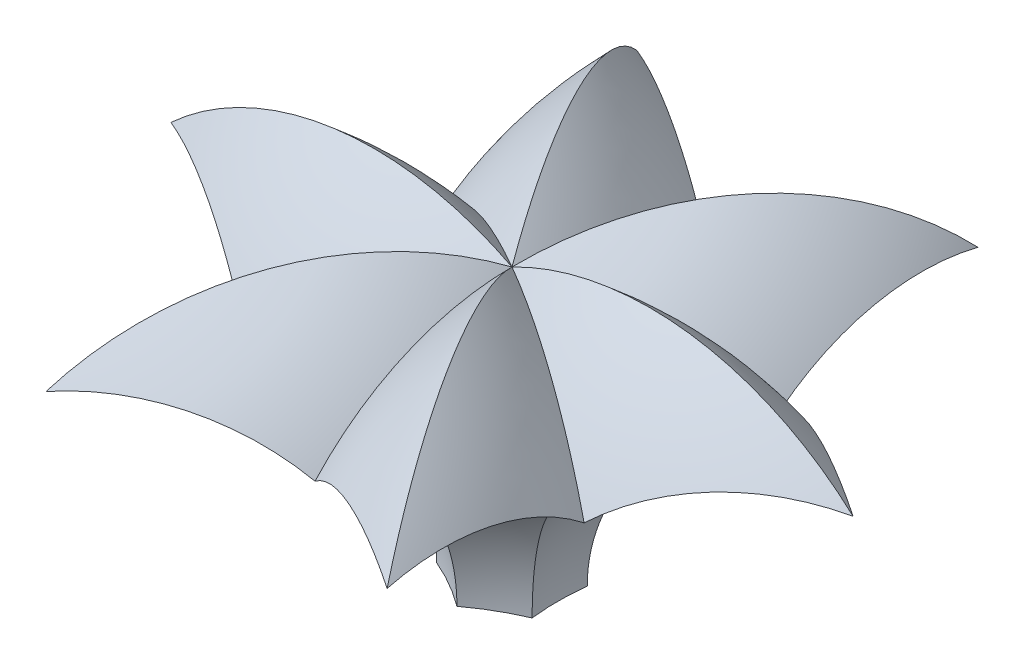
ISO-10303-21;
HEADER;
FILE_DESCRIPTION(('STEP AP214'),'2;1');
FILE_NAME('part.step','',(''),(''),'','','');
FILE_SCHEMA(('AUTOMOTIVE_DESIGN { 1 0 10303 214 1 1 1 1 }'));
ENDSEC;
DATA;
#1=APPLICATION_CONTEXT('core data for automotive mechanical design processes');
#2=APPLICATION_PROTOCOL_DEFINITION('international standard','automotive_design',2000,#1);
#3=PRODUCT_CONTEXT('',#1,'mechanical');
#4=PRODUCT('Part','Part','',(#3));
#5=PRODUCT_RELATED_PRODUCT_CATEGORY('part','',(#4));
#6=PRODUCT_DEFINITION_FORMATION('','',#4);
#7=PRODUCT_DEFINITION_CONTEXT('part definition',#1,'design');
#8=PRODUCT_DEFINITION('design','',#6,#7);
#9=PRODUCT_DEFINITION_SHAPE('','',#8);
#10=(LENGTH_UNIT() NAMED_UNIT(*) SI_UNIT(.MILLI.,.METRE.));
#11=(NAMED_UNIT(*) PLANE_ANGLE_UNIT() SI_UNIT($,.RADIAN.));
#12=(NAMED_UNIT(*) SI_UNIT($,.STERADIAN.) SOLID_ANGLE_UNIT());
#13=UNCERTAINTY_MEASURE_WITH_UNIT(LENGTH_MEASURE(1.E-05),#10,'distance_accuracy_value','');
#14=(GEOMETRIC_REPRESENTATION_CONTEXT(3) GLOBAL_UNCERTAINTY_ASSIGNED_CONTEXT((#13)) GLOBAL_UNIT_ASSIGNED_CONTEXT((#10,
#11,#12)) REPRESENTATION_CONTEXT('',''));
#15=CARTESIAN_POINT('',(0.,0.,0.));
#16=DIRECTION('',(0.,0.,1.));
#17=DIRECTION('',(1.,0.,0.));
#18=AXIS2_PLACEMENT_3D('',#15,#16,#17);
#19=CARTESIAN_POINT('',(-22.5000000000005,0.,-38.9711431702995));
#20=DIRECTION('',(0.,0.,1.));
#21=DIRECTION('',(-1.,0.,0.));
#22=AXIS2_PLACEMENT_3D('',#19,#20,#21);
#23=SPHERICAL_SURFACE('',#22,37.5);
#24=CARTESIAN_POINT('',(-19.8611111111113,0.,-43.5418328013845));
#25=DIRECTION('',(0.499999999999995,0.,-0.866025403784441));
#26=DIRECTION('',(-0.866025403784442,0.,-0.499999999999995));
#27=AXIS2_PLACEMENT_3D('',#24,#25,#26);
#28=CIRCLE('',#27,37.1267432146746);
#29=CARTESIAN_POINT('',(-27.7777777777772,35.9837497617132,-48.1125224324685));
#30=VERTEX_POINT('',#29);
#31=CARTESIAN_POINT('',(0.,29.1966336353671,-32.0750149549794));
#32=VERTEX_POINT('',#31);
#33=EDGE_CURVE('E189',#30,#32,#28,.T.);
#34=ORIENTED_EDGE('',*,*,#33,.T.);
#35=CARTESIAN_POINT('',(0.,0.,-38.9711431702995));
#36=DIRECTION('',(-1.,0.,0.));
#37=DIRECTION('',(0.,0.,1.));
#38=AXIS2_PLACEMENT_3D('',#35,#36,#37);
#39=CIRCLE('',#38,29.9999999999997);
#40=CARTESIAN_POINT('',(0.,0.,-8.97114317029982));
#41=VERTEX_POINT('',#40);
#42=EDGE_CURVE('E199',#41,#32,#39,.T.);
#43=ORIENTED_EDGE('',*,*,#42,.F.);
#44=CARTESIAN_POINT('',(-22.5000000000005,0.,-38.9711431702995));
#45=DIRECTION('',(0.,1.,0.));
#46=DIRECTION('',(0.,0.,1.));
#47=AXIS2_PLACEMENT_3D('',#44,#45,#46);
#48=CIRCLE('',#47,37.5);
#49=CARTESIAN_POINT('',(-7.76923788646684,0.,-4.4855715851498));
#50=VERTEX_POINT('',#49);
#51=EDGE_CURVE('E175',#50,#41,#48,.T.);
#52=ORIENTED_EDGE('',*,*,#51,.F.);
#53=CARTESIAN_POINT('',(-33.7500000000002,0.,-19.4855715851497));
#54=DIRECTION('',(-0.499999999999995,0.,0.866025403784441));
#55=DIRECTION('',(0.866025403784442,0.,0.499999999999995));
#56=AXIS2_PLACEMENT_3D('',#53,#54,#55);
#57=CIRCLE('',#56,30.0000000000002);
#58=CARTESIAN_POINT('',(-27.7777777777778,29.1966336353671,-16.03750747749));
#59=VERTEX_POINT('',#58);
#60=EDGE_CURVE('E202',#50,#59,#57,.T.);
#61=ORIENTED_EDGE('',*,*,#60,.T.);
#62=CARTESIAN_POINT('',(-27.7777777777772,0.,-38.9711431702995));
#63=DIRECTION('',(-1.,0.,0.));
#64=DIRECTION('',(0.,0.,1.));
#65=AXIS2_PLACEMENT_3D('',#62,#63,#64);
#66=CIRCLE('',#65,37.1267432146749);
#67=EDGE_CURVE('E191',#59,#30,#66,.T.);
#68=ORIENTED_EDGE('',*,*,#67,.T.);
#69=EDGE_LOOP('',(#34,#43,#52,#61,#68));
#70=FACE_BOUND('',#69,.T.);
#71=ADVANCED_FACE('F33',(#70),#23,.F.);
#72=CARTESIAN_POINT('',(-22.5000000000005,0.,38.9711431702995));
#73=DIRECTION('',(0.,0.,1.));
#74=DIRECTION('',(-1.,0.,0.));
#75=AXIS2_PLACEMENT_3D('',#72,#73,#74);
#76=SPHERICAL_SURFACE('',#75,37.5);
#77=CARTESIAN_POINT('',(-19.8611111111113,0.,43.5418328013845));
#78=DIRECTION('',(0.499999999999995,0.,0.866025403784441));
#79=DIRECTION('',(0.866025403784442,0.,-0.499999999999995));
#80=AXIS2_PLACEMENT_3D('',#77,#78,#79);
#81=CIRCLE('',#80,37.1267432146746);
#82=CARTESIAN_POINT('',(0.,29.1966336353671,32.0750149549794));
#83=VERTEX_POINT('',#82);
#84=CARTESIAN_POINT('',(-27.7777777777772,35.9837497617132,48.1125224324685));
#85=VERTEX_POINT('',#84);
#86=EDGE_CURVE('E195',#83,#85,#81,.T.);
#87=ORIENTED_EDGE('',*,*,#86,.T.);
#88=CARTESIAN_POINT('',(-27.7777777777772,0.,38.9711431702995));
#89=DIRECTION('',(-1.,0.,0.));
#90=DIRECTION('',(0.,0.,1.));
#91=AXIS2_PLACEMENT_3D('',#88,#89,#90);
#92=CIRCLE('',#91,37.1267432146749);
#93=CARTESIAN_POINT('',(-27.7777777777778,29.1966336353671,16.03750747749));
#94=VERTEX_POINT('',#93);
#95=EDGE_CURVE('E58',#85,#94,#92,.T.);
#96=ORIENTED_EDGE('',*,*,#95,.T.);
#97=CARTESIAN_POINT('',(-33.7500000000002,0.,19.4855715851497));
#98=DIRECTION('',(0.499999999999995,0.,0.866025403784441));
#99=DIRECTION('',(0.866025403784442,0.,-0.499999999999995));
#100=AXIS2_PLACEMENT_3D('',#97,#98,#99);
#101=CIRCLE('',#100,30.0000000000002);
#102=CARTESIAN_POINT('',(-7.76923788646684,0.,4.4855715851498));
#103=VERTEX_POINT('',#102);
#104=EDGE_CURVE('E204',#103,#94,#101,.T.);
#105=ORIENTED_EDGE('',*,*,#104,.F.);
#106=CARTESIAN_POINT('',(-22.5000000000005,0.,38.9711431702995));
#107=DIRECTION('',(0.,1.,0.));
#108=DIRECTION('',(0.,0.,1.));
#109=AXIS2_PLACEMENT_3D('',#106,#107,#108);
#110=CIRCLE('',#109,37.5);
#111=CARTESIAN_POINT('',(0.,0.,8.97114317029982));
#112=VERTEX_POINT('',#111);
#113=EDGE_CURVE('E177',#112,#103,#110,.T.);
#114=ORIENTED_EDGE('',*,*,#113,.F.);
#115=CARTESIAN_POINT('',(0.,0.,38.9711431702995));
#116=DIRECTION('',(1.,0.,0.));
#117=DIRECTION('',(0.,0.,-1.));
#118=AXIS2_PLACEMENT_3D('',#115,#116,#117);
#119=CIRCLE('',#118,29.9999999999997);
#120=EDGE_CURVE('E37',#112,#83,#119,.T.);
#121=ORIENTED_EDGE('',*,*,#120,.T.);
#122=EDGE_LOOP('',(#87,#96,#105,#114,#121));
#123=FACE_BOUND('',#122,.T.);
#124=ADVANCED_FACE('F211',(#123),#76,.F.);
#125=CARTESIAN_POINT('',(22.5000000000005,0.,38.9711431702995));
#126=DIRECTION('',(0.,0.,1.));
#127=DIRECTION('',(-1.,0.,0.));
#128=AXIS2_PLACEMENT_3D('',#125,#126,#127);
#129=SPHERICAL_SURFACE('',#128,37.5);
#130=CARTESIAN_POINT('',(19.8611111111113,0.,43.5418328013845));
#131=DIRECTION('',(-0.499999999999995,0.,0.866025403784442));
#132=DIRECTION('',(0.866025403784442,0.,0.499999999999995));
#133=AXIS2_PLACEMENT_3D('',#130,#131,#132);
#134=CIRCLE('',#133,37.1267432146746);
#135=CARTESIAN_POINT('',(27.7777777777772,35.9837497617132,48.1125224324685));
#136=VERTEX_POINT('',#135);
#137=EDGE_CURVE('E193',#136,#83,#134,.T.);
#138=ORIENTED_EDGE('',*,*,#137,.T.);
#139=ORIENTED_EDGE('',*,*,#120,.F.);
#140=CARTESIAN_POINT('',(22.5000000000005,0.,38.9711431702995));
#141=DIRECTION('',(0.,1.,0.));
#142=DIRECTION('',(0.,0.,1.));
#143=AXIS2_PLACEMENT_3D('',#140,#141,#142);
#144=CIRCLE('',#143,37.5);
#145=CARTESIAN_POINT('',(7.76923788646684,0.,4.4855715851498));
#146=VERTEX_POINT('',#145);
#147=EDGE_CURVE('E127',#146,#112,#144,.T.);
#148=ORIENTED_EDGE('',*,*,#147,.F.);
#149=CARTESIAN_POINT('',(33.7500000000002,0.,19.4855715851497));
#150=DIRECTION('',(-0.499999999999995,0.,0.866025403784442));
#151=DIRECTION('',(0.866025403784442,0.,0.499999999999995));
#152=AXIS2_PLACEMENT_3D('',#149,#150,#151);
#153=CIRCLE('',#152,30.0000000000002);
#154=CARTESIAN_POINT('',(27.7777777777778,29.1966336353671,16.03750747749));
#155=VERTEX_POINT('',#154);
#156=EDGE_CURVE('E122',#155,#146,#153,.T.);
#157=ORIENTED_EDGE('',*,*,#156,.F.);
#158=CARTESIAN_POINT('',(27.7777777777772,0.,38.9711431702995));
#159=DIRECTION('',(1.,0.,0.));
#160=DIRECTION('',(0.,0.,-1.));
#161=AXIS2_PLACEMENT_3D('',#158,#159,#160);
#162=CIRCLE('',#161,37.1267432146749);
#163=EDGE_CURVE('E111',#136,#155,#162,.F.);
#164=ORIENTED_EDGE('',*,*,#163,.F.);
#165=EDGE_LOOP('',(#138,#139,#148,#157,#164));
#166=FACE_BOUND('',#165,.T.);
#167=ADVANCED_FACE('F124',(#166),#129,.F.);
#168=CARTESIAN_POINT('',(-45.,0.,0.));
#169=DIRECTION('',(0.,0.,1.));
#170=DIRECTION('',(-1.,0.,0.));
#171=AXIS2_PLACEMENT_3D('',#168,#169,#170);
#172=SPHERICAL_SURFACE('',#171,37.5);
#173=ORIENTED_EDGE('',*,*,#60,.F.);
#174=CARTESIAN_POINT('',(-45.,0.,0.));
#175=DIRECTION('',(0.,1.,0.));
#176=DIRECTION('',(0.,0.,1.));
#177=AXIS2_PLACEMENT_3D('',#174,#175,#176);
#178=CIRCLE('',#177,37.5);
#179=EDGE_CURVE('E160',#103,#50,#178,.T.);
#180=ORIENTED_EDGE('',*,*,#179,.F.);
#181=ORIENTED_EDGE('',*,*,#104,.T.);
#182=CARTESIAN_POINT('',(-47.6388888888891,0.,4.57068963108498));
#183=DIRECTION('',(-0.499999999999995,0.,0.866025403784441));
#184=DIRECTION('',(0.866025403784442,0.,0.499999999999995));
#185=AXIS2_PLACEMENT_3D('',#182,#183,#184);
#186=CIRCLE('',#185,37.1267432146746);
#187=CARTESIAN_POINT('',(-55.5555555555566,35.9837497617127,0.));
#188=VERTEX_POINT('',#187);
#189=EDGE_CURVE('E137',#94,#188,#186,.T.);
#190=ORIENTED_EDGE('',*,*,#189,.T.);
#191=CARTESIAN_POINT('',(-47.6388888888891,0.,-4.57068963108498));
#192=DIRECTION('',(-0.499999999999995,0.,-0.866025403784441));
#193=DIRECTION('',(-0.866025403784442,0.,0.499999999999995));
#194=AXIS2_PLACEMENT_3D('',#191,#192,#193);
#195=CIRCLE('',#194,37.1267432146746);
#196=EDGE_CURVE('E119',#59,#188,#195,.F.);
#197=ORIENTED_EDGE('',*,*,#196,.F.);
#198=EDGE_LOOP('',(#173,#180,#181,#190,#197));
#199=FACE_BOUND('',#198,.T.);
#200=ADVANCED_FACE('F225',(#199),#172,.F.);
#201=CARTESIAN_POINT('',(45.,0.,0.));
#202=DIRECTION('',(0.,0.,1.));
#203=DIRECTION('',(-1.,0.,0.));
#204=AXIS2_PLACEMENT_3D('',#201,#202,#203);
#205=SPHERICAL_SURFACE('',#204,37.5);
#206=CARTESIAN_POINT('',(47.6388888888891,0.,-4.570689631085));
#207=DIRECTION('',(0.499999999999995,0.,-0.866025403784442));
#208=DIRECTION('',(-0.866025403784442,0.,-0.499999999999995));
#209=AXIS2_PLACEMENT_3D('',#206,#207,#208);
#210=CIRCLE('',#209,37.1267432146746);
#211=CARTESIAN_POINT('',(27.7777777777778,29.1966336353671,-16.03750747749));
#212=VERTEX_POINT('',#211);
#213=CARTESIAN_POINT('',(55.5555555555567,35.9837497617127,0.));
#214=VERTEX_POINT('',#213);
#215=EDGE_CURVE('E136',#212,#214,#210,.T.);
#216=ORIENTED_EDGE('',*,*,#215,.T.);
#217=CARTESIAN_POINT('',(47.6388888888891,0.,4.570689631085));
#218=DIRECTION('',(0.499999999999995,0.,0.866025403784442));
#219=DIRECTION('',(0.866025403784442,0.,-0.499999999999995));
#220=AXIS2_PLACEMENT_3D('',#217,#218,#219);
#221=CIRCLE('',#220,37.1267432146746);
#222=EDGE_CURVE('E133',#214,#155,#221,.T.);
#223=ORIENTED_EDGE('',*,*,#222,.T.);
#224=ORIENTED_EDGE('',*,*,#156,.T.);
#225=CARTESIAN_POINT('',(45.,0.,0.));
#226=DIRECTION('',(0.,1.,0.));
#227=DIRECTION('',(0.,0.,1.));
#228=AXIS2_PLACEMENT_3D('',#225,#226,#227);
#229=CIRCLE('',#228,37.5);
#230=CARTESIAN_POINT('',(7.76923788646684,0.,-4.4855715851498));
#231=VERTEX_POINT('',#230);
#232=EDGE_CURVE('E155',#231,#146,#229,.T.);
#233=ORIENTED_EDGE('',*,*,#232,.F.);
#234=CARTESIAN_POINT('',(33.7500000000002,0.,-19.4855715851497));
#235=DIRECTION('',(-0.499999999999995,0.,-0.866025403784442));
#236=DIRECTION('',(-0.866025403784442,0.,0.499999999999995));
#237=AXIS2_PLACEMENT_3D('',#234,#235,#236);
#238=CIRCLE('',#237,30.0000000000002);
#239=EDGE_CURVE('E130',#231,#212,#238,.T.);
#240=ORIENTED_EDGE('',*,*,#239,.T.);
#241=EDGE_LOOP('',(#216,#223,#224,#233,#240));
#242=FACE_BOUND('',#241,.T.);
#243=ADVANCED_FACE('F134',(#242),#205,.F.);
#244=CARTESIAN_POINT('',(22.5000000000005,0.,-38.9711431702995));
#245=DIRECTION('',(0.,0.,1.));
#246=DIRECTION('',(-1.,0.,0.));
#247=AXIS2_PLACEMENT_3D('',#244,#245,#246);
#248=SPHERICAL_SURFACE('',#247,37.5);
#249=CARTESIAN_POINT('',(19.8611111111113,0.,-43.5418328013845));
#250=DIRECTION('',(-0.499999999999995,0.,-0.866025403784442));
#251=DIRECTION('',(-0.866025403784442,0.,0.499999999999995));
#252=AXIS2_PLACEMENT_3D('',#249,#250,#251);
#253=CIRCLE('',#252,37.1267432146746);
#254=CARTESIAN_POINT('',(27.7777777777772,35.9837497617132,-48.1125224324685));
#255=VERTEX_POINT('',#254);
#256=EDGE_CURVE('E183',#32,#255,#253,.T.);
#257=ORIENTED_EDGE('',*,*,#256,.T.);
#258=CARTESIAN_POINT('',(27.7777777777772,0.,-38.9711431702995));
#259=DIRECTION('',(1.,0.,0.));
#260=DIRECTION('',(0.,0.,-1.));
#261=AXIS2_PLACEMENT_3D('',#258,#259,#260);
#262=CIRCLE('',#261,37.1267432146749);
#263=EDGE_CURVE('E186',#255,#212,#262,.T.);
#264=ORIENTED_EDGE('',*,*,#263,.T.);
#265=ORIENTED_EDGE('',*,*,#239,.F.);
#266=CARTESIAN_POINT('',(22.5000000000005,0.,-38.9711431702995));
#267=DIRECTION('',(0.,1.,0.));
#268=DIRECTION('',(0.,0.,1.));
#269=AXIS2_PLACEMENT_3D('',#266,#267,#268);
#270=CIRCLE('',#269,37.5);
#271=EDGE_CURVE('E171',#41,#231,#270,.T.);
#272=ORIENTED_EDGE('',*,*,#271,.F.);
#273=ORIENTED_EDGE('',*,*,#42,.T.);
#274=EDGE_LOOP('',(#257,#264,#265,#272,#273));
#275=FACE_BOUND('',#274,.T.);
#276=ADVANCED_FACE('F241',(#275),#248,.F.);
#277=CARTESIAN_POINT('',(22.5000000000005,0.,38.9711431702995));
#278=DIRECTION('',(0.,0.,1.));
#279=DIRECTION('',(-1.,0.,0.));
#280=AXIS2_PLACEMENT_3D('',#277,#278,#279);
#281=SPHERICAL_SURFACE('',#280,62.5);
#282=ORIENTED_EDGE('',*,*,#215,.F.);
#283=CARTESIAN_POINT('',(0.,0.,0.));
#284=DIRECTION('',(0.50000000000001,0.,0.866025403784433));
#285=DIRECTION('',(0.866025403784433,0.,-0.50000000000001));
#286=AXIS2_PLACEMENT_3D('',#283,#284,#285);
#287=CIRCLE('',#286,43.3733789322437);
#288=CARTESIAN_POINT('',(0.,43.3733789322437,0.));
#289=VERTEX_POINT('',#288);
#290=EDGE_CURVE('E140',#212,#289,#287,.T.);
#291=ORIENTED_EDGE('',*,*,#290,.T.);
#292=CARTESIAN_POINT('',(22.5000000000005,0.,0.));
#293=DIRECTION('',(0.,0.,1.));
#294=DIRECTION('',(1.,0.,0.));
#295=AXIS2_PLACEMENT_3D('',#292,#293,#294);
#296=CIRCLE('',#295,48.8620507142304);
#297=EDGE_CURVE('E50',#214,#289,#296,.T.);
#298=ORIENTED_EDGE('',*,*,#297,.F.);
#299=EDGE_LOOP('',(#282,#291,#298));
#300=FACE_BOUND('',#299,.T.);
#301=ADVANCED_FACE('F250',(#300),#281,.T.);
#302=CARTESIAN_POINT('',(45.,0.,0.));
#303=DIRECTION('',(0.,0.,1.));
#304=DIRECTION('',(-1.,0.,0.));
#305=AXIS2_PLACEMENT_3D('',#302,#303,#304);
#306=SPHERICAL_SURFACE('',#305,62.5);
#307=ORIENTED_EDGE('',*,*,#256,.F.);
#308=CARTESIAN_POINT('',(0.,0.,0.));
#309=DIRECTION('',(1.,0.,0.));
#310=DIRECTION('',(0.,0.,-1.));
#311=AXIS2_PLACEMENT_3D('',#308,#309,#310);
#312=CIRCLE('',#311,43.3733789322437);
#313=EDGE_CURVE('E145',#32,#289,#312,.T.);
#314=ORIENTED_EDGE('',*,*,#313,.T.);
#315=CARTESIAN_POINT('',(11.2499999999998,0.,-19.4855715851497));
#316=DIRECTION('',(0.866025403784441,0.,0.499999999999995));
#317=DIRECTION('',(0.499999999999995,0.,-0.866025403784442));
#318=AXIS2_PLACEMENT_3D('',#315,#316,#317);
#319=CIRCLE('',#318,48.8620507142301);
#320=EDGE_CURVE('E148',#255,#289,#319,.T.);
#321=ORIENTED_EDGE('',*,*,#320,.F.);
#322=EDGE_LOOP('',(#307,#314,#321));
#323=FACE_BOUND('',#322,.T.);
#324=ADVANCED_FACE('F245',(#323),#306,.T.);
#325=CARTESIAN_POINT('',(-45.,0.,0.));
#326=DIRECTION('',(0.,0.,1.));
#327=DIRECTION('',(-1.,0.,0.));
#328=AXIS2_PLACEMENT_3D('',#325,#326,#327);
#329=SPHERICAL_SURFACE('',#328,62.5);
#330=ORIENTED_EDGE('',*,*,#33,.F.);
#331=CARTESIAN_POINT('',(-11.2499999999998,0.,-19.4855715851497));
#332=DIRECTION('',(0.866025403784441,0.,-0.499999999999995));
#333=DIRECTION('',(-0.499999999999995,0.,-0.866025403784442));
#334=AXIS2_PLACEMENT_3D('',#331,#332,#333);
#335=CIRCLE('',#334,48.8620507142301);
#336=EDGE_CURVE('E153',#30,#289,#335,.T.);
#337=ORIENTED_EDGE('',*,*,#336,.T.);
#338=ORIENTED_EDGE('',*,*,#313,.F.);
#339=EDGE_LOOP('',(#330,#337,#338));
#340=FACE_BOUND('',#339,.T.);
#341=ADVANCED_FACE('F237',(#340),#329,.T.);
#342=CARTESIAN_POINT('',(-22.5000000000005,0.,38.9711431702995));
#343=DIRECTION('',(0.,0.,-1.));
#344=DIRECTION('',(1.,0.,0.));
#345=AXIS2_PLACEMENT_3D('',#342,#343,#344);
#346=SPHERICAL_SURFACE('',#345,62.5);
#347=CARTESIAN_POINT('',(0.,0.,0.));
#348=DIRECTION('',(-0.50000000000001,0.,0.866025403784433));
#349=DIRECTION('',(0.866025403784433,0.,0.50000000000001));
#350=AXIS2_PLACEMENT_3D('',#347,#348,#349);
#351=CIRCLE('',#350,43.3733789322437);
#352=EDGE_CURVE('E164',#59,#289,#351,.F.);
#353=ORIENTED_EDGE('',*,*,#352,.F.);
#354=ORIENTED_EDGE('',*,*,#196,.T.);
#355=CARTESIAN_POINT('',(-22.5000000000005,0.,0.));
#356=DIRECTION('',(0.,0.,1.));
#357=DIRECTION('',(1.,0.,0.));
#358=AXIS2_PLACEMENT_3D('',#355,#356,#357);
#359=CIRCLE('',#358,48.8620507142304);
#360=EDGE_CURVE('E149',#188,#289,#359,.F.);
#361=ORIENTED_EDGE('',*,*,#360,.T.);
#362=EDGE_LOOP('',(#353,#354,#361));
#363=FACE_BOUND('',#362,.T.);
#364=ADVANCED_FACE('F231',(#363),#346,.T.);
#365=CARTESIAN_POINT('',(22.5000000000005,0.,-38.9711431702995));
#366=DIRECTION('',(0.,0.,1.));
#367=DIRECTION('',(-1.,0.,0.));
#368=AXIS2_PLACEMENT_3D('',#365,#366,#367);
#369=SPHERICAL_SURFACE('',#368,62.5);
#370=ORIENTED_EDGE('',*,*,#67,.F.);
#371=ORIENTED_EDGE('',*,*,#352,.T.);
#372=ORIENTED_EDGE('',*,*,#336,.F.);
#373=EDGE_LOOP('',(#370,#371,#372));
#374=FACE_BOUND('',#373,.T.);
#375=ADVANCED_FACE('F234',(#374),#369,.T.);
#376=CARTESIAN_POINT('',(-22.5000000000005,0.,-38.9711431702995));
#377=DIRECTION('',(0.,0.,1.));
#378=DIRECTION('',(-1.,0.,0.));
#379=AXIS2_PLACEMENT_3D('',#376,#377,#378);
#380=SPHERICAL_SURFACE('',#379,62.5);
#381=ORIENTED_EDGE('',*,*,#263,.F.);
#382=ORIENTED_EDGE('',*,*,#320,.T.);
#383=ORIENTED_EDGE('',*,*,#290,.F.);
#384=EDGE_LOOP('',(#381,#382,#383));
#385=FACE_BOUND('',#384,.T.);
#386=ADVANCED_FACE('F248',(#385),#380,.T.);
#387=CARTESIAN_POINT('',(22.5000000000005,0.,-38.9711431702995));
#388=DIRECTION('',(0.,0.,1.));
#389=DIRECTION('',(-1.,0.,0.));
#390=AXIS2_PLACEMENT_3D('',#387,#388,#389);
#391=SPHERICAL_SURFACE('',#390,62.5);
#392=ORIENTED_EDGE('',*,*,#222,.F.);
#393=ORIENTED_EDGE('',*,*,#297,.T.);
#394=CARTESIAN_POINT('',(0.,0.,0.));
#395=DIRECTION('',(-0.50000000000001,0.,0.866025403784433));
#396=DIRECTION('',(0.866025403784433,0.,0.50000000000001));
#397=AXIS2_PLACEMENT_3D('',#394,#395,#396);
#398=CIRCLE('',#397,43.3733789322437);
#399=EDGE_CURVE('E114',#289,#155,#398,.F.);
#400=ORIENTED_EDGE('',*,*,#399,.T.);
#401=EDGE_LOOP('',(#392,#393,#400));
#402=FACE_BOUND('',#401,.T.);
#403=ADVANCED_FACE('F139',(#402),#391,.T.);
#404=CARTESIAN_POINT('',(45.,0.,0.));
#405=DIRECTION('',(0.,0.,1.));
#406=DIRECTION('',(-1.,0.,0.));
#407=AXIS2_PLACEMENT_3D('',#404,#405,#406);
#408=SPHERICAL_SURFACE('',#407,62.5);
#409=ORIENTED_EDGE('',*,*,#137,.F.);
#410=CARTESIAN_POINT('',(11.2499999999998,0.,19.4855715851497));
#411=DIRECTION('',(-0.866025403784441,0.,0.499999999999995));
#412=DIRECTION('',(0.499999999999995,0.,0.866025403784442));
#413=AXIS2_PLACEMENT_3D('',#410,#411,#412);
#414=CIRCLE('',#413,48.8620507142301);
#415=EDGE_CURVE('E42',#289,#136,#414,.F.);
#416=ORIENTED_EDGE('',*,*,#415,.F.);
#417=CARTESIAN_POINT('',(0.,0.,0.));
#418=DIRECTION('',(1.,0.,0.));
#419=DIRECTION('',(0.,0.,-1.));
#420=AXIS2_PLACEMENT_3D('',#417,#418,#419);
#421=CIRCLE('',#420,43.3733789322437);
#422=EDGE_CURVE('E11',#289,#83,#421,.T.);
#423=ORIENTED_EDGE('',*,*,#422,.T.);
#424=EDGE_LOOP('',(#409,#416,#423));
#425=FACE_BOUND('',#424,.T.);
#426=ADVANCED_FACE('F214',(#425),#408,.T.);
#427=CARTESIAN_POINT('',(-22.5000000000005,0.,-38.9711431702995));
#428=DIRECTION('',(0.,0.,1.));
#429=DIRECTION('',(-1.,0.,0.));
#430=AXIS2_PLACEMENT_3D('',#427,#428,#429);
#431=SPHERICAL_SURFACE('',#430,62.5);
#432=ORIENTED_EDGE('',*,*,#189,.F.);
#433=CARTESIAN_POINT('',(0.,0.,0.));
#434=DIRECTION('',(0.50000000000001,0.,0.866025403784433));
#435=DIRECTION('',(0.866025403784433,0.,-0.50000000000001));
#436=AXIS2_PLACEMENT_3D('',#433,#434,#435);
#437=CIRCLE('',#436,43.3733789322437);
#438=EDGE_CURVE('E150',#289,#94,#437,.T.);
#439=ORIENTED_EDGE('',*,*,#438,.F.);
#440=ORIENTED_EDGE('',*,*,#360,.F.);
#441=EDGE_LOOP('',(#432,#439,#440));
#442=FACE_BOUND('',#441,.T.);
#443=ADVANCED_FACE('F222',(#442),#431,.T.);
#444=CARTESIAN_POINT('',(-45.,0.,0.));
#445=DIRECTION('',(0.,0.,1.));
#446=DIRECTION('',(-1.,0.,0.));
#447=AXIS2_PLACEMENT_3D('',#444,#445,#446);
#448=SPHERICAL_SURFACE('',#447,62.5);
#449=ORIENTED_EDGE('',*,*,#86,.F.);
#450=ORIENTED_EDGE('',*,*,#422,.F.);
#451=CARTESIAN_POINT('',(-11.2499999999998,0.,19.4855715851497));
#452=DIRECTION('',(0.866025403784441,0.,0.499999999999995));
#453=DIRECTION('',(0.499999999999995,0.,-0.866025403784442));
#454=AXIS2_PLACEMENT_3D('',#451,#452,#453);
#455=CIRCLE('',#454,48.8620507142301);
#456=EDGE_CURVE('E152',#289,#85,#455,.T.);
#457=ORIENTED_EDGE('',*,*,#456,.T.);
#458=EDGE_LOOP('',(#449,#450,#457));
#459=FACE_BOUND('',#458,.T.);
#460=ADVANCED_FACE('F216',(#459),#448,.T.);
#461=CARTESIAN_POINT('',(22.5000000000005,0.,38.9711431702995));
#462=DIRECTION('',(0.,0.,1.));
#463=DIRECTION('',(-1.,0.,0.));
#464=AXIS2_PLACEMENT_3D('',#461,#462,#463);
#465=SPHERICAL_SURFACE('',#464,62.5);
#466=ORIENTED_EDGE('',*,*,#95,.F.);
#467=ORIENTED_EDGE('',*,*,#456,.F.);
#468=ORIENTED_EDGE('',*,*,#438,.T.);
#469=EDGE_LOOP('',(#466,#467,#468));
#470=FACE_BOUND('',#469,.T.);
#471=ADVANCED_FACE('F217',(#470),#465,.T.);
#472=CARTESIAN_POINT('',(-22.5000000000005,0.,38.9711431702995));
#473=DIRECTION('',(0.,0.,-1.));
#474=DIRECTION('',(1.,0.,0.));
#475=AXIS2_PLACEMENT_3D('',#472,#473,#474);
#476=SPHERICAL_SURFACE('',#475,62.5);
#477=ORIENTED_EDGE('',*,*,#415,.T.);
#478=ORIENTED_EDGE('',*,*,#163,.T.);
#479=ORIENTED_EDGE('',*,*,#399,.F.);
#480=EDGE_LOOP('',(#477,#478,#479));
#481=FACE_BOUND('',#480,.T.);
#482=ADVANCED_FACE('F113',(#481),#476,.T.);
#483=CARTESIAN_POINT('',(0.,0.,0.));
#484=DIRECTION('',(0.,1.,0.));
#485=DIRECTION('',(0.,0.,1.));
#486=AXIS2_PLACEMENT_3D('',#483,#484,#485);
#487=PLANE('',#486);
#488=ORIENTED_EDGE('',*,*,#113,.T.);
#489=ORIENTED_EDGE('',*,*,#179,.T.);
#490=ORIENTED_EDGE('',*,*,#51,.T.);
#491=ORIENTED_EDGE('',*,*,#271,.T.);
#492=ORIENTED_EDGE('',*,*,#232,.T.);
#493=ORIENTED_EDGE('',*,*,#147,.T.);
#494=EDGE_LOOP('',(#488,#489,#490,#491,#492,#493));
#495=FACE_BOUND('',#494,.T.);
#496=ADVANCED_FACE('F35',(#495),#487,.F.);
#497=CLOSED_SHELL('',(#71,#124,#167,#200,#243,#276,#301,#324,#341,#364,#375,#386,#403,#426,#443,
#460,#471,#482,#496));
#498=MANIFOLD_SOLID_BREP('B2',#497);
#499=ADVANCED_BREP_SHAPE_REPRESENTATION('',(#18,#498),#14);
#500=SHAPE_DEFINITION_REPRESENTATION(#9,#499);
ENDSEC;
END-ISO-10303-21;
